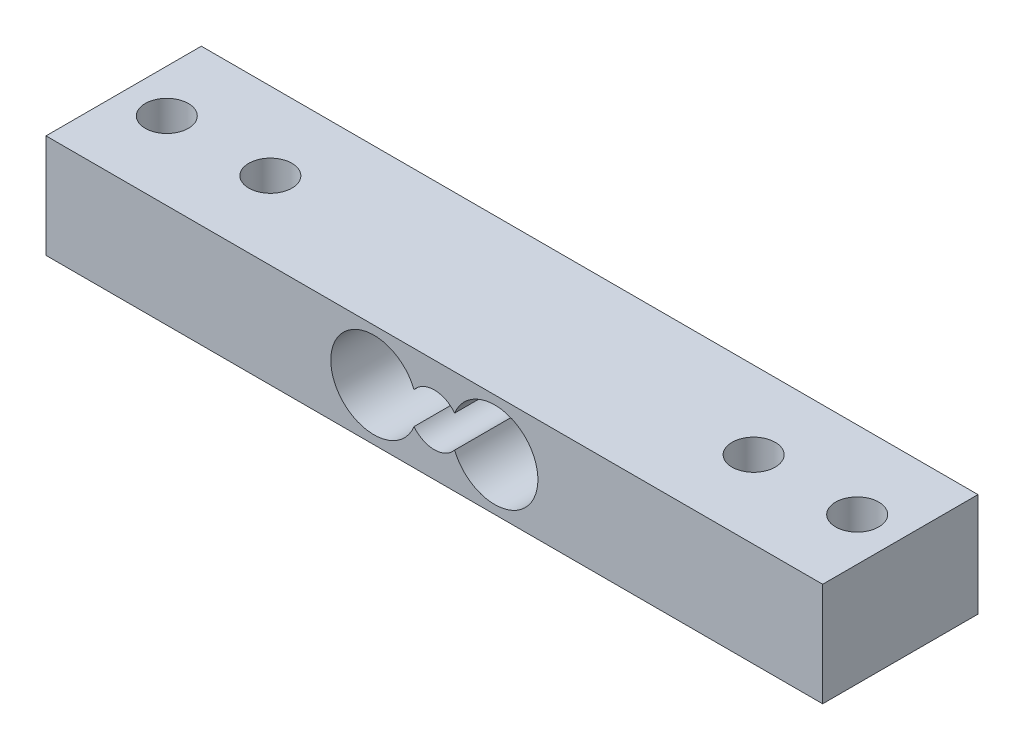
ISO-10303-21;
HEADER;
FILE_DESCRIPTION(('STEP AP214'),'2;1');
FILE_NAME('part.step','',(''),(''),'','','');
FILE_SCHEMA(('AUTOMOTIVE_DESIGN { 1 0 10303 214 1 1 1 1 }'));
ENDSEC;
DATA;
#1=APPLICATION_CONTEXT('core data for automotive mechanical design processes');
#2=APPLICATION_PROTOCOL_DEFINITION('international standard','automotive_design',2000,#1);
#3=PRODUCT_CONTEXT('',#1,'mechanical');
#4=PRODUCT('Part','Part','',(#3));
#5=PRODUCT_RELATED_PRODUCT_CATEGORY('part','',(#4));
#6=PRODUCT_DEFINITION_FORMATION('','',#4);
#7=PRODUCT_DEFINITION_CONTEXT('part definition',#1,'design');
#8=PRODUCT_DEFINITION('design','',#6,#7);
#9=PRODUCT_DEFINITION_SHAPE('','',#8);
#10=(LENGTH_UNIT() NAMED_UNIT(*) SI_UNIT(.MILLI.,.METRE.));
#11=(NAMED_UNIT(*) PLANE_ANGLE_UNIT() SI_UNIT($,.RADIAN.));
#12=(NAMED_UNIT(*) SI_UNIT($,.STERADIAN.) SOLID_ANGLE_UNIT());
#13=UNCERTAINTY_MEASURE_WITH_UNIT(LENGTH_MEASURE(1.E-05),#10,'distance_accuracy_value','');
#14=(GEOMETRIC_REPRESENTATION_CONTEXT(3) GLOBAL_UNCERTAINTY_ASSIGNED_CONTEXT((#13)) GLOBAL_UNIT_ASSIGNED_CONTEXT((#10,
#11,#12)) REPRESENTATION_CONTEXT('',''));
#15=CARTESIAN_POINT('',(0.,0.,0.));
#16=DIRECTION('',(0.,0.,1.));
#17=DIRECTION('',(1.,0.,0.));
#18=AXIS2_PLACEMENT_3D('',#15,#16,#17);
#19=CARTESIAN_POINT('',(0.,6.,0.));
#20=DIRECTION('',(1.,0.,0.));
#21=DIRECTION('',(0.,0.,-1.));
#22=AXIS2_PLACEMENT_3D('',#19,#20,#21);
#23=PLANE('',#22);
#24=DIRECTION('',(0.,0.,1.));
#25=VECTOR('',#24,1.);
#26=CARTESIAN_POINT('',(0.,0.,0.));
#27=LINE('',#26,#25);
#28=CARTESIAN_POINT('',(0.,0.,-9.));
#29=VERTEX_POINT('',#28);
#30=CARTESIAN_POINT('',(0.,0.,0.));
#31=VERTEX_POINT('',#30);
#32=EDGE_CURVE('E160',#29,#31,#27,.T.);
#33=ORIENTED_EDGE('',*,*,#32,.T.);
#34=DIRECTION('',(0.,-1.,0.));
#35=VECTOR('',#34,1.);
#36=CARTESIAN_POINT('',(0.,6.,0.));
#37=LINE('',#36,#35);
#38=CARTESIAN_POINT('',(0.,6.,0.));
#39=VERTEX_POINT('',#38);
#40=EDGE_CURVE('E11',#39,#31,#37,.T.);
#41=ORIENTED_EDGE('',*,*,#40,.F.);
#42=DIRECTION('',(0.,0.,1.));
#43=VECTOR('',#42,1.);
#44=CARTESIAN_POINT('',(0.,6.,0.));
#45=LINE('',#44,#43);
#46=CARTESIAN_POINT('',(0.,6.,-9.));
#47=VERTEX_POINT('',#46);
#48=EDGE_CURVE('E161',#47,#39,#45,.T.);
#49=ORIENTED_EDGE('',*,*,#48,.F.);
#50=DIRECTION('',(0.,-1.,0.));
#51=VECTOR('',#50,1.);
#52=CARTESIAN_POINT('',(0.,6.,-9.));
#53=LINE('',#52,#51);
#54=EDGE_CURVE('E171',#47,#29,#53,.T.);
#55=ORIENTED_EDGE('',*,*,#54,.T.);
#56=EDGE_LOOP('',(#33,#41,#49,#55));
#57=FACE_BOUND('',#56,.T.);
#58=ADVANCED_FACE('F36',(#57),#23,.F.);
#59=CARTESIAN_POINT('',(0.,6.,0.));
#60=DIRECTION('',(0.,0.,-1.));
#61=DIRECTION('',(-1.,0.,0.));
#62=AXIS2_PLACEMENT_3D('',#59,#60,#61);
#63=PLANE('',#62);
#64=CARTESIAN_POINT('',(22.5,3.,0.));
#65=DIRECTION('',(0.,0.,1.));
#66=DIRECTION('',(1.,0.,0.));
#67=AXIS2_PLACEMENT_3D('',#64,#65,#66);
#68=CIRCLE('',#67,1.5);
#69=CARTESIAN_POINT('',(21.3214285714286,2.07211563880238,0.));
#70=VERTEX_POINT('',#69);
#71=CARTESIAN_POINT('',(23.6785714285714,2.07211563880239,0.));
#72=VERTEX_POINT('',#71);
#73=EDGE_CURVE('E127',#70,#72,#68,.T.);
#74=ORIENTED_EDGE('',*,*,#73,.F.);
#75=CARTESIAN_POINT('',(19.,3.,0.));
#76=DIRECTION('',(0.,0.,1.));
#77=DIRECTION('',(1.,0.,0.));
#78=AXIS2_PLACEMENT_3D('',#75,#76,#77);
#79=CIRCLE('',#78,2.5);
#80=CARTESIAN_POINT('',(21.3214285714286,3.92788436119762,0.));
#81=VERTEX_POINT('',#80);
#82=EDGE_CURVE('E50',#81,#70,#79,.T.);
#83=ORIENTED_EDGE('',*,*,#82,.F.);
#84=CARTESIAN_POINT('',(22.5,3.,0.));
#85=DIRECTION('',(0.,0.,1.));
#86=DIRECTION('',(1.,0.,0.));
#87=AXIS2_PLACEMENT_3D('',#84,#85,#86);
#88=CIRCLE('',#87,1.5);
#89=CARTESIAN_POINT('',(23.6785714285714,3.92788436119761,0.));
#90=VERTEX_POINT('',#89);
#91=EDGE_CURVE('E118',#90,#81,#88,.T.);
#92=ORIENTED_EDGE('',*,*,#91,.F.);
#93=CARTESIAN_POINT('',(26.,3.,0.));
#94=DIRECTION('',(0.,0.,1.));
#95=DIRECTION('',(-1.,0.,0.));
#96=AXIS2_PLACEMENT_3D('',#93,#94,#95);
#97=CIRCLE('',#96,2.5);
#98=EDGE_CURVE('E121',#72,#90,#97,.T.);
#99=ORIENTED_EDGE('',*,*,#98,.F.);
#100=EDGE_LOOP('',(#74,#83,#92,#99));
#101=FACE_BOUND('',#100,.T.);
#102=DIRECTION('',(1.,0.,0.));
#103=VECTOR('',#102,1.);
#104=CARTESIAN_POINT('',(0.,0.,0.));
#105=LINE('',#104,#103);
#106=CARTESIAN_POINT('',(45.,0.,0.));
#107=VERTEX_POINT('',#106);
#108=EDGE_CURVE('E174',#31,#107,#105,.T.);
#109=ORIENTED_EDGE('',*,*,#108,.T.);
#110=DIRECTION('',(0.,-1.,0.));
#111=VECTOR('',#110,1.);
#112=CARTESIAN_POINT('',(45.,6.,0.));
#113=LINE('',#112,#111);
#114=CARTESIAN_POINT('',(45.,6.,0.));
#115=VERTEX_POINT('',#114);
#116=EDGE_CURVE('E43',#115,#107,#113,.T.);
#117=ORIENTED_EDGE('',*,*,#116,.F.);
#118=DIRECTION('',(1.,0.,0.));
#119=VECTOR('',#118,1.);
#120=CARTESIAN_POINT('',(0.,6.,0.));
#121=LINE('',#120,#119);
#122=EDGE_CURVE('E164',#39,#115,#121,.T.);
#123=ORIENTED_EDGE('',*,*,#122,.F.);
#124=ORIENTED_EDGE('',*,*,#40,.T.);
#125=EDGE_LOOP('',(#109,#117,#123,#124));
#126=FACE_BOUND('',#125,.T.);
#127=ADVANCED_FACE('F202',(#101,#126),#63,.F.);
#128=CARTESIAN_POINT('',(45.,6.,0.));
#129=DIRECTION('',(-1.,0.,0.));
#130=DIRECTION('',(0.,0.,1.));
#131=AXIS2_PLACEMENT_3D('',#128,#129,#130);
#132=PLANE('',#131);
#133=DIRECTION('',(0.,0.,-1.));
#134=VECTOR('',#133,1.);
#135=CARTESIAN_POINT('',(45.,0.,0.));
#136=LINE('',#135,#134);
#137=CARTESIAN_POINT('',(45.,0.,-9.));
#138=VERTEX_POINT('',#137);
#139=EDGE_CURVE('E176',#107,#138,#136,.T.);
#140=ORIENTED_EDGE('',*,*,#139,.T.);
#141=DIRECTION('',(0.,-1.,0.));
#142=VECTOR('',#141,1.);
#143=CARTESIAN_POINT('',(45.,6.,-9.));
#144=LINE('',#143,#142);
#145=CARTESIAN_POINT('',(45.,6.,-9.));
#146=VERTEX_POINT('',#145);
#147=EDGE_CURVE('E181',#146,#138,#144,.T.);
#148=ORIENTED_EDGE('',*,*,#147,.F.);
#149=DIRECTION('',(0.,0.,-1.));
#150=VECTOR('',#149,1.);
#151=CARTESIAN_POINT('',(45.,6.,0.));
#152=LINE('',#151,#150);
#153=EDGE_CURVE('E167',#115,#146,#152,.T.);
#154=ORIENTED_EDGE('',*,*,#153,.F.);
#155=ORIENTED_EDGE('',*,*,#116,.T.);
#156=EDGE_LOOP('',(#140,#148,#154,#155));
#157=FACE_BOUND('',#156,.T.);
#158=ADVANCED_FACE('F188',(#157),#132,.F.);
#159=CARTESIAN_POINT('',(0.,6.,-9.));
#160=DIRECTION('',(0.,0.,1.));
#161=DIRECTION('',(1.,0.,0.));
#162=AXIS2_PLACEMENT_3D('',#159,#160,#161);
#163=PLANE('',#162);
#164=CARTESIAN_POINT('',(22.5,3.,-9.));
#165=DIRECTION('',(0.,0.,1.));
#166=DIRECTION('',(1.,0.,0.));
#167=AXIS2_PLACEMENT_3D('',#164,#165,#166);
#168=CIRCLE('',#167,1.5);
#169=CARTESIAN_POINT('',(23.6785714285714,3.92788436119761,-9.));
#170=VERTEX_POINT('',#169);
#171=CARTESIAN_POINT('',(21.3214285714286,3.92788436119762,-9.));
#172=VERTEX_POINT('',#171);
#173=EDGE_CURVE('E108',#170,#172,#168,.T.);
#174=ORIENTED_EDGE('',*,*,#173,.T.);
#175=CARTESIAN_POINT('',(19.,3.,-9.));
#176=DIRECTION('',(0.,0.,1.));
#177=DIRECTION('',(1.,0.,0.));
#178=AXIS2_PLACEMENT_3D('',#175,#176,#177);
#179=CIRCLE('',#178,2.5);
#180=CARTESIAN_POINT('',(21.3214285714286,2.07211563880238,-9.));
#181=VERTEX_POINT('',#180);
#182=EDGE_CURVE('E102',#172,#181,#179,.T.);
#183=ORIENTED_EDGE('',*,*,#182,.T.);
#184=CARTESIAN_POINT('',(22.5,3.,-9.));
#185=DIRECTION('',(0.,0.,1.));
#186=DIRECTION('',(1.,0.,0.));
#187=AXIS2_PLACEMENT_3D('',#184,#185,#186);
#188=CIRCLE('',#187,1.5);
#189=CARTESIAN_POINT('',(23.6785714285714,2.07211563880239,-9.));
#190=VERTEX_POINT('',#189);
#191=EDGE_CURVE('E111',#181,#190,#188,.T.);
#192=ORIENTED_EDGE('',*,*,#191,.T.);
#193=CARTESIAN_POINT('',(26.,3.,-9.));
#194=DIRECTION('',(0.,0.,1.));
#195=DIRECTION('',(-1.,0.,0.));
#196=AXIS2_PLACEMENT_3D('',#193,#194,#195);
#197=CIRCLE('',#196,2.5);
#198=EDGE_CURVE('E58',#190,#170,#197,.T.);
#199=ORIENTED_EDGE('',*,*,#198,.T.);
#200=EDGE_LOOP('',(#174,#183,#192,#199));
#201=FACE_BOUND('',#200,.T.);
#202=DIRECTION('',(-1.,0.,0.));
#203=VECTOR('',#202,1.);
#204=CARTESIAN_POINT('',(0.,0.,-9.));
#205=LINE('',#204,#203);
#206=EDGE_CURVE('E165',#138,#29,#205,.T.);
#207=ORIENTED_EDGE('',*,*,#206,.T.);
#208=ORIENTED_EDGE('',*,*,#54,.F.);
#209=DIRECTION('',(-1.,0.,0.));
#210=VECTOR('',#209,1.);
#211=CARTESIAN_POINT('',(0.,6.,-9.));
#212=LINE('',#211,#210);
#213=EDGE_CURVE('E169',#146,#47,#212,.T.);
#214=ORIENTED_EDGE('',*,*,#213,.F.);
#215=ORIENTED_EDGE('',*,*,#147,.T.);
#216=EDGE_LOOP('',(#207,#208,#214,#215));
#217=FACE_BOUND('',#216,.T.);
#218=ADVANCED_FACE('F115',(#201,#217),#163,.F.);
#219=CARTESIAN_POINT('',(0.,6.,0.));
#220=DIRECTION('',(0.,-1.,0.));
#221=DIRECTION('',(0.,0.,-1.));
#222=AXIS2_PLACEMENT_3D('',#219,#220,#221);
#223=PLANE('',#222);
#224=CARTESIAN_POINT('',(2.5,6.,-4.5));
#225=DIRECTION('',(0.,1.,0.));
#226=DIRECTION('',(0.,0.,1.));
#227=AXIS2_PLACEMENT_3D('',#224,#225,#226);
#228=CIRCLE('',#227,1.25);
#229=CARTESIAN_POINT('',(2.5,6.,-3.25));
#230=VERTEX_POINT('',#229);
#231=EDGE_CURVE('E133',#230,#230,#228,.T.);
#232=ORIENTED_EDGE('',*,*,#231,.F.);
#233=EDGE_LOOP('',(#232));
#234=FACE_BOUND('',#233,.T.);
#235=CARTESIAN_POINT('',(8.5,6.,-4.5));
#236=DIRECTION('',(0.,1.,0.));
#237=DIRECTION('',(0.,0.,1.));
#238=AXIS2_PLACEMENT_3D('',#235,#236,#237);
#239=CIRCLE('',#238,1.25);
#240=CARTESIAN_POINT('',(8.5,6.,-3.25));
#241=VERTEX_POINT('',#240);
#242=EDGE_CURVE('E142',#241,#241,#239,.T.);
#243=ORIENTED_EDGE('',*,*,#242,.F.);
#244=EDGE_LOOP('',(#243));
#245=FACE_BOUND('',#244,.T.);
#246=CARTESIAN_POINT('',(36.5,6.,-4.5));
#247=DIRECTION('',(0.,1.,0.));
#248=DIRECTION('',(0.,0.,1.));
#249=AXIS2_PLACEMENT_3D('',#246,#247,#248);
#250=CIRCLE('',#249,1.25);
#251=CARTESIAN_POINT('',(36.5,6.,-3.25));
#252=VERTEX_POINT('',#251);
#253=EDGE_CURVE('E148',#252,#252,#250,.T.);
#254=ORIENTED_EDGE('',*,*,#253,.F.);
#255=EDGE_LOOP('',(#254));
#256=FACE_BOUND('',#255,.T.);
#257=CARTESIAN_POINT('',(42.5,6.,-4.5));
#258=DIRECTION('',(0.,1.,0.));
#259=DIRECTION('',(0.,0.,1.));
#260=AXIS2_PLACEMENT_3D('',#257,#258,#259);
#261=CIRCLE('',#260,1.25);
#262=CARTESIAN_POINT('',(42.5,6.,-3.25));
#263=VERTEX_POINT('',#262);
#264=EDGE_CURVE('E154',#263,#263,#261,.T.);
#265=ORIENTED_EDGE('',*,*,#264,.F.);
#266=EDGE_LOOP('',(#265));
#267=FACE_BOUND('',#266,.T.);
#268=ORIENTED_EDGE('',*,*,#48,.T.);
#269=ORIENTED_EDGE('',*,*,#122,.T.);
#270=ORIENTED_EDGE('',*,*,#153,.T.);
#271=ORIENTED_EDGE('',*,*,#213,.T.);
#272=EDGE_LOOP('',(#268,#269,#270,#271));
#273=FACE_BOUND('',#272,.T.);
#274=ADVANCED_FACE('F201',(#234,#245,#256,#267,#273),#223,.F.);
#275=CARTESIAN_POINT('',(0.,0.,0.));
#276=DIRECTION('',(0.,-1.,0.));
#277=DIRECTION('',(0.,0.,-1.));
#278=AXIS2_PLACEMENT_3D('',#275,#276,#277);
#279=PLANE('',#278);
#280=CARTESIAN_POINT('',(2.5,0.,-4.5));
#281=DIRECTION('',(0.,1.,0.));
#282=DIRECTION('',(0.,0.,1.));
#283=AXIS2_PLACEMENT_3D('',#280,#281,#282);
#284=CIRCLE('',#283,1.25);
#285=CARTESIAN_POINT('',(2.5,0.,-3.25));
#286=VERTEX_POINT('',#285);
#287=EDGE_CURVE('E139',#286,#286,#284,.T.);
#288=ORIENTED_EDGE('',*,*,#287,.T.);
#289=EDGE_LOOP('',(#288));
#290=FACE_BOUND('',#289,.T.);
#291=CARTESIAN_POINT('',(8.5,0.,-4.5));
#292=DIRECTION('',(0.,1.,0.));
#293=DIRECTION('',(0.,0.,1.));
#294=AXIS2_PLACEMENT_3D('',#291,#292,#293);
#295=CIRCLE('',#294,1.25);
#296=CARTESIAN_POINT('',(8.5,0.,-3.25));
#297=VERTEX_POINT('',#296);
#298=EDGE_CURVE('E145',#297,#297,#295,.T.);
#299=ORIENTED_EDGE('',*,*,#298,.T.);
#300=EDGE_LOOP('',(#299));
#301=FACE_BOUND('',#300,.T.);
#302=CARTESIAN_POINT('',(36.5,0.,-4.5));
#303=DIRECTION('',(0.,1.,0.));
#304=DIRECTION('',(0.,0.,1.));
#305=AXIS2_PLACEMENT_3D('',#302,#303,#304);
#306=CIRCLE('',#305,1.25);
#307=CARTESIAN_POINT('',(36.5,0.,-3.25));
#308=VERTEX_POINT('',#307);
#309=EDGE_CURVE('E151',#308,#308,#306,.T.);
#310=ORIENTED_EDGE('',*,*,#309,.T.);
#311=EDGE_LOOP('',(#310));
#312=FACE_BOUND('',#311,.T.);
#313=CARTESIAN_POINT('',(42.5,0.,-4.5));
#314=DIRECTION('',(0.,1.,0.));
#315=DIRECTION('',(0.,0.,1.));
#316=AXIS2_PLACEMENT_3D('',#313,#314,#315);
#317=CIRCLE('',#316,1.25);
#318=CARTESIAN_POINT('',(42.5,0.,-3.25));
#319=VERTEX_POINT('',#318);
#320=EDGE_CURVE('E157',#319,#319,#317,.T.);
#321=ORIENTED_EDGE('',*,*,#320,.T.);
#322=EDGE_LOOP('',(#321));
#323=FACE_BOUND('',#322,.T.);
#324=ORIENTED_EDGE('',*,*,#32,.F.);
#325=ORIENTED_EDGE('',*,*,#206,.F.);
#326=ORIENTED_EDGE('',*,*,#139,.F.);
#327=ORIENTED_EDGE('',*,*,#108,.F.);
#328=EDGE_LOOP('',(#324,#325,#326,#327));
#329=FACE_BOUND('',#328,.T.);
#330=ADVANCED_FACE('F194',(#290,#301,#312,#323,#329),#279,.T.);
#331=CARTESIAN_POINT('',(42.5,6.,-4.5));
#332=DIRECTION('',(0.,1.,0.));
#333=DIRECTION('',(0.,0.,1.));
#334=AXIS2_PLACEMENT_3D('',#331,#332,#333);
#335=CYLINDRICAL_SURFACE('',#334,1.25);
#336=ORIENTED_EDGE('',*,*,#320,.F.);
#337=EDGE_LOOP('',(#336));
#338=FACE_BOUND('',#337,.T.);
#339=ORIENTED_EDGE('',*,*,#264,.T.);
#340=EDGE_LOOP('',(#339));
#341=FACE_BOUND('',#340,.T.);
#342=ADVANCED_FACE('F215',(#338,#341),#335,.F.);
#343=CARTESIAN_POINT('',(36.5,6.,-4.5));
#344=DIRECTION('',(0.,1.,0.));
#345=DIRECTION('',(0.,0.,1.));
#346=AXIS2_PLACEMENT_3D('',#343,#344,#345);
#347=CYLINDRICAL_SURFACE('',#346,1.25);
#348=ORIENTED_EDGE('',*,*,#309,.F.);
#349=EDGE_LOOP('',(#348));
#350=FACE_BOUND('',#349,.T.);
#351=ORIENTED_EDGE('',*,*,#253,.T.);
#352=EDGE_LOOP('',(#351));
#353=FACE_BOUND('',#352,.T.);
#354=ADVANCED_FACE('F222',(#350,#353),#347,.F.);
#355=CARTESIAN_POINT('',(8.5,6.,-4.5));
#356=DIRECTION('',(0.,1.,0.));
#357=DIRECTION('',(0.,0.,1.));
#358=AXIS2_PLACEMENT_3D('',#355,#356,#357);
#359=CYLINDRICAL_SURFACE('',#358,1.25);
#360=ORIENTED_EDGE('',*,*,#298,.F.);
#361=EDGE_LOOP('',(#360));
#362=FACE_BOUND('',#361,.T.);
#363=ORIENTED_EDGE('',*,*,#242,.T.);
#364=EDGE_LOOP('',(#363));
#365=FACE_BOUND('',#364,.T.);
#366=ADVANCED_FACE('F226',(#362,#365),#359,.F.);
#367=CARTESIAN_POINT('',(2.5,6.,-4.5));
#368=DIRECTION('',(0.,1.,0.));
#369=DIRECTION('',(0.,0.,1.));
#370=AXIS2_PLACEMENT_3D('',#367,#368,#369);
#371=CYLINDRICAL_SURFACE('',#370,1.25);
#372=ORIENTED_EDGE('',*,*,#287,.F.);
#373=EDGE_LOOP('',(#372));
#374=FACE_BOUND('',#373,.T.);
#375=ORIENTED_EDGE('',*,*,#231,.T.);
#376=EDGE_LOOP('',(#375));
#377=FACE_BOUND('',#376,.T.);
#378=ADVANCED_FACE('F230',(#374,#377),#371,.F.);
#379=CARTESIAN_POINT('',(19.,3.,-9.));
#380=DIRECTION('',(0.,0.,1.));
#381=DIRECTION('',(1.,0.,0.));
#382=AXIS2_PLACEMENT_3D('',#379,#380,#381);
#383=CYLINDRICAL_SURFACE('',#382,2.5);
#384=ORIENTED_EDGE('',*,*,#82,.T.);
#385=DIRECTION('',(0.,0.,1.));
#386=VECTOR('',#385,1.);
#387=CARTESIAN_POINT('',(21.3214285714286,2.07211563880238,-9.));
#388=LINE('',#387,#386);
#389=EDGE_CURVE('E98',#181,#70,#388,.T.);
#390=ORIENTED_EDGE('',*,*,#389,.F.);
#391=ORIENTED_EDGE('',*,*,#182,.F.);
#392=DIRECTION('',(0.,0.,1.));
#393=VECTOR('',#392,1.);
#394=CARTESIAN_POINT('',(21.3214285714286,3.92788436119762,-9.));
#395=LINE('',#394,#393);
#396=EDGE_CURVE('E131',#172,#81,#395,.T.);
#397=ORIENTED_EDGE('',*,*,#396,.T.);
#398=EDGE_LOOP('',(#384,#390,#391,#397));
#399=FACE_BOUND('',#398,.T.);
#400=ADVANCED_FACE('F100',(#399),#383,.F.);
#401=CARTESIAN_POINT('',(22.5,3.,-9.));
#402=DIRECTION('',(0.,0.,1.));
#403=DIRECTION('',(1.,0.,0.));
#404=AXIS2_PLACEMENT_3D('',#401,#402,#403);
#405=CYLINDRICAL_SURFACE('',#404,1.5);
#406=ORIENTED_EDGE('',*,*,#91,.T.);
#407=ORIENTED_EDGE('',*,*,#396,.F.);
#408=ORIENTED_EDGE('',*,*,#173,.F.);
#409=DIRECTION('',(0.,0.,1.));
#410=VECTOR('',#409,1.);
#411=CARTESIAN_POINT('',(23.6785714285714,3.92788436119761,-9.));
#412=LINE('',#411,#410);
#413=EDGE_CURVE('E134',#170,#90,#412,.T.);
#414=ORIENTED_EDGE('',*,*,#413,.T.);
#415=EDGE_LOOP('',(#406,#407,#408,#414));
#416=FACE_BOUND('',#415,.T.);
#417=ADVANCED_FACE('F237',(#416),#405,.F.);
#418=CARTESIAN_POINT('',(26.,3.,-9.));
#419=DIRECTION('',(0.,0.,1.));
#420=DIRECTION('',(1.,0.,0.));
#421=AXIS2_PLACEMENT_3D('',#418,#419,#420);
#422=CYLINDRICAL_SURFACE('',#421,2.5);
#423=ORIENTED_EDGE('',*,*,#98,.T.);
#424=ORIENTED_EDGE('',*,*,#413,.F.);
#425=ORIENTED_EDGE('',*,*,#198,.F.);
#426=DIRECTION('',(0.,0.,1.));
#427=VECTOR('',#426,1.);
#428=CARTESIAN_POINT('',(23.6785714285714,2.07211563880239,-9.));
#429=LINE('',#428,#427);
#430=EDGE_CURVE('E107',#190,#72,#429,.T.);
#431=ORIENTED_EDGE('',*,*,#430,.T.);
#432=EDGE_LOOP('',(#423,#424,#425,#431));
#433=FACE_BOUND('',#432,.T.);
#434=ADVANCED_FACE('F240',(#433),#422,.F.);
#435=CARTESIAN_POINT('',(22.5,3.,-9.));
#436=DIRECTION('',(0.,0.,1.));
#437=DIRECTION('',(1.,0.,0.));
#438=AXIS2_PLACEMENT_3D('',#435,#436,#437);
#439=CYLINDRICAL_SURFACE('',#438,1.5);
#440=ORIENTED_EDGE('',*,*,#73,.T.);
#441=ORIENTED_EDGE('',*,*,#430,.F.);
#442=ORIENTED_EDGE('',*,*,#191,.F.);
#443=ORIENTED_EDGE('',*,*,#389,.T.);
#444=EDGE_LOOP('',(#440,#441,#442,#443));
#445=FACE_BOUND('',#444,.T.);
#446=ADVANCED_FACE('F112',(#445),#439,.F.);
#447=CLOSED_SHELL('',(#58,#127,#158,#218,#274,#330,#342,#354,#366,#378,#400,#417,#434,#446));
#448=MANIFOLD_SOLID_BREP('B2',#447);
#449=ADVANCED_BREP_SHAPE_REPRESENTATION('',(#18,#448),#14);
#450=SHAPE_DEFINITION_REPRESENTATION(#9,#449);
ENDSEC;
END-ISO-10303-21;
